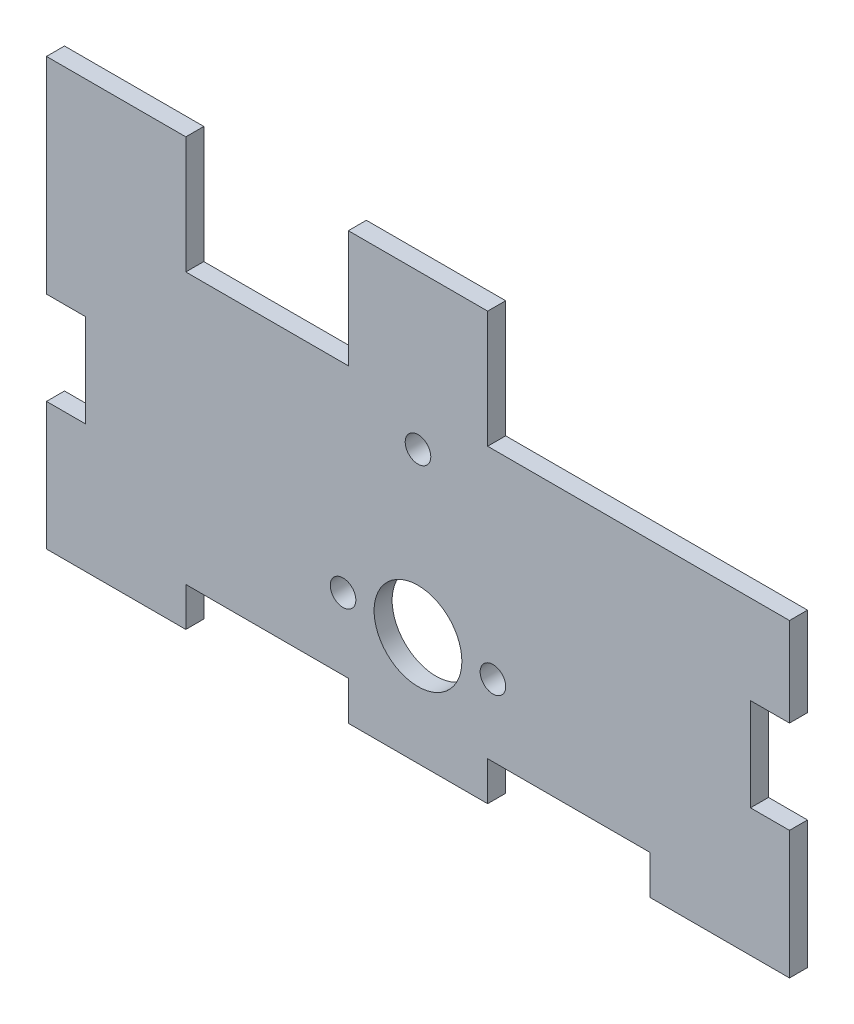
ISO-10303-21;
HEADER;
FILE_DESCRIPTION(('STEP AP214'),'2;1');
FILE_NAME('part.step','',(''),(''),'','','');
FILE_SCHEMA(('AUTOMOTIVE_DESIGN { 1 0 10303 214 1 1 1 1 }'));
ENDSEC;
DATA;
#1=APPLICATION_CONTEXT('core data for automotive mechanical design processes');
#2=APPLICATION_PROTOCOL_DEFINITION('international standard','automotive_design',2000,#1);
#3=PRODUCT_CONTEXT('',#1,'mechanical');
#4=PRODUCT('Part','Part','',(#3));
#5=PRODUCT_RELATED_PRODUCT_CATEGORY('part','',(#4));
#6=PRODUCT_DEFINITION_FORMATION('','',#4);
#7=PRODUCT_DEFINITION_CONTEXT('part definition',#1,'design');
#8=PRODUCT_DEFINITION('design','',#6,#7);
#9=PRODUCT_DEFINITION_SHAPE('','',#8);
#10=(LENGTH_UNIT() NAMED_UNIT(*) SI_UNIT(.MILLI.,.METRE.));
#11=(NAMED_UNIT(*) PLANE_ANGLE_UNIT() SI_UNIT($,.RADIAN.));
#12=(NAMED_UNIT(*) SI_UNIT($,.STERADIAN.) SOLID_ANGLE_UNIT());
#13=UNCERTAINTY_MEASURE_WITH_UNIT(LENGTH_MEASURE(1.E-05),#10,'distance_accuracy_value','');
#14=(GEOMETRIC_REPRESENTATION_CONTEXT(3) GLOBAL_UNCERTAINTY_ASSIGNED_CONTEXT((#13)) GLOBAL_UNIT_ASSIGNED_CONTEXT((#10,
#11,#12)) REPRESENTATION_CONTEXT('',''));
#15=CARTESIAN_POINT('',(0.,0.,0.));
#16=DIRECTION('',(0.,0.,1.));
#17=DIRECTION('',(1.,0.,0.));
#18=AXIS2_PLACEMENT_3D('',#15,#16,#17);
#19=CARTESIAN_POINT('',(-50.8,18.499999957,2.4638));
#20=DIRECTION('',(0.,-1.,0.));
#21=DIRECTION('',(0.,0.,-1.));
#22=AXIS2_PLACEMENT_3D('',#19,#20,#21);
#23=PLANE('',#22);
#24=DIRECTION('',(0.,0.,-1.));
#25=VECTOR('',#24,1.);
#26=CARTESIAN_POINT('',(9.525,18.499999957,-6.59758706000879E-12));
#27=LINE('',#26,#25);
#28=CARTESIAN_POINT('',(9.525,18.499999957,2.4638));
#29=VERTEX_POINT('',#28);
#30=CARTESIAN_POINT('',(9.525,18.499999957,0.));
#31=VERTEX_POINT('',#30);
#32=EDGE_CURVE('E58',#29,#31,#27,.T.);
#33=ORIENTED_EDGE('',*,*,#32,.F.);
#34=DIRECTION('',(-1.,0.,0.));
#35=VECTOR('',#34,1.);
#36=CARTESIAN_POINT('',(-50.8,18.499999957,2.4638));
#37=LINE('',#36,#35);
#38=CARTESIAN_POINT('',(50.8,18.499999957,2.4638));
#39=VERTEX_POINT('',#38);
#40=EDGE_CURVE('E259',#39,#29,#37,.T.);
#41=ORIENTED_EDGE('',*,*,#40,.F.);
#42=DIRECTION('',(0.,0.,-1.));
#43=VECTOR('',#42,1.);
#44=CARTESIAN_POINT('',(50.8,18.499999957,2.4638));
#45=LINE('',#44,#43);
#46=CARTESIAN_POINT('',(50.8,18.499999957,0.));
#47=VERTEX_POINT('',#46);
#48=EDGE_CURVE('E295',#39,#47,#45,.T.);
#49=ORIENTED_EDGE('',*,*,#48,.T.);
#50=DIRECTION('',(-1.,0.,0.));
#51=VECTOR('',#50,1.);
#52=CARTESIAN_POINT('',(-50.8,18.499999957,0.));
#53=LINE('',#52,#51);
#54=EDGE_CURVE('E271',#47,#31,#53,.T.);
#55=ORIENTED_EDGE('',*,*,#54,.T.);
#56=EDGE_LOOP('',(#33,#41,#49,#55));
#57=FACE_BOUND('',#56,.T.);
#58=ADVANCED_FACE('F33',(#57),#23,.F.);
#59=DIRECTION('',(0.,0.,1.));
#60=VECTOR('',#59,1.);
#61=CARTESIAN_POINT('',(-9.525,18.499999957,-6.59758706000879E-12));
#62=LINE('',#61,#60);
#63=CARTESIAN_POINT('',(-9.525,18.499999957,-6.59758706000879E-12));
#64=VERTEX_POINT('',#63);
#65=CARTESIAN_POINT('',(-9.525,18.499999957,2.4638));
#66=VERTEX_POINT('',#65);
#67=EDGE_CURVE('E231',#64,#66,#62,.T.);
#68=ORIENTED_EDGE('',*,*,#67,.F.);
#69=CARTESIAN_POINT('',(-31.75,18.499999957,0.));
#70=VERTEX_POINT('',#69);
#71=EDGE_CURVE('E269',#64,#70,#53,.T.);
#72=ORIENTED_EDGE('',*,*,#71,.T.);
#73=DIRECTION('',(0.,0.,-1.));
#74=VECTOR('',#73,1.);
#75=CARTESIAN_POINT('',(-31.75,18.499999957,0.));
#76=LINE('',#75,#74);
#77=CARTESIAN_POINT('',(-31.75,18.499999957,2.4638));
#78=VERTEX_POINT('',#77);
#79=EDGE_CURVE('E234',#78,#70,#76,.T.);
#80=ORIENTED_EDGE('',*,*,#79,.F.);
#81=EDGE_CURVE('E37',#66,#78,#37,.T.);
#82=ORIENTED_EDGE('',*,*,#81,.F.);
#83=EDGE_LOOP('',(#68,#72,#80,#82));
#84=FACE_BOUND('',#83,.T.);
#85=ADVANCED_FACE('F423',(#84),#23,.F.);
#86=CARTESIAN_POINT('',(50.8,18.499999957,2.4638));
#87=DIRECTION('',(-1.,0.,0.));
#88=DIRECTION('',(0.,-1.,0.));
#89=AXIS2_PLACEMENT_3D('',#86,#87,#88);
#90=PLANE('',#89);
#91=DIRECTION('',(0.,1.,0.));
#92=VECTOR('',#91,1.);
#93=CARTESIAN_POINT('',(50.8,18.499999957,0.));
#94=LINE('',#93,#92);
#95=CARTESIAN_POINT('',(50.8,-23.833999957,0.));
#96=VERTEX_POINT('',#95);
#97=CARTESIAN_POINT('',(50.8,-6.35,0.));
#98=VERTEX_POINT('',#97);
#99=EDGE_CURVE('E272',#96,#98,#94,.T.);
#100=ORIENTED_EDGE('',*,*,#99,.T.);
#101=DIRECTION('',(0.,0.,1.));
#102=VECTOR('',#101,1.);
#103=CARTESIAN_POINT('',(50.8,-6.35,2.4638));
#104=LINE('',#103,#102);
#105=CARTESIAN_POINT('',(50.8,-6.35,2.4638));
#106=VERTEX_POINT('',#105);
#107=EDGE_CURVE('E504',#98,#106,#104,.T.);
#108=ORIENTED_EDGE('',*,*,#107,.T.);
#109=DIRECTION('',(0.,1.,0.));
#110=VECTOR('',#109,1.);
#111=CARTESIAN_POINT('',(50.8,18.499999957,2.4638));
#112=LINE('',#111,#110);
#113=CARTESIAN_POINT('',(50.8,-23.833999957,2.4638));
#114=VERTEX_POINT('',#113);
#115=EDGE_CURVE('E351',#114,#106,#112,.T.);
#116=ORIENTED_EDGE('',*,*,#115,.F.);
#117=DIRECTION('',(0.,0.,1.));
#118=VECTOR('',#117,1.);
#119=CARTESIAN_POINT('',(50.8,-23.833999957,2.4638));
#120=LINE('',#119,#118);
#121=EDGE_CURVE('E451',#96,#114,#120,.T.);
#122=ORIENTED_EDGE('',*,*,#121,.F.);
#123=EDGE_LOOP('',(#100,#108,#116,#122));
#124=FACE_BOUND('',#123,.T.);
#125=ADVANCED_FACE('F502',(#124),#90,.F.);
#126=CARTESIAN_POINT('',(-50.8,18.499999957,2.4638));
#127=DIRECTION('',(1.,0.,0.));
#128=DIRECTION('',(0.,1.,0.));
#129=AXIS2_PLACEMENT_3D('',#126,#127,#128);
#130=PLANE('',#129);
#131=DIRECTION('',(0.,-1.,0.));
#132=VECTOR('',#131,1.);
#133=CARTESIAN_POINT('',(-50.8,18.499999957,2.4638));
#134=LINE('',#133,#132);
#135=CARTESIAN_POINT('',(-50.8,-6.35,2.4638));
#136=VERTEX_POINT('',#135);
#137=CARTESIAN_POINT('',(-50.8,-23.833999957,2.4638));
#138=VERTEX_POINT('',#137);
#139=EDGE_CURVE('E403',#136,#138,#134,.T.);
#140=ORIENTED_EDGE('',*,*,#139,.F.);
#141=DIRECTION('',(0.,0.,-1.));
#142=VECTOR('',#141,1.);
#143=CARTESIAN_POINT('',(-50.8,-6.35,2.4638));
#144=LINE('',#143,#142);
#145=CARTESIAN_POINT('',(-50.8,-6.35,0.));
#146=VERTEX_POINT('',#145);
#147=EDGE_CURVE('E379',#136,#146,#144,.T.);
#148=ORIENTED_EDGE('',*,*,#147,.T.);
#149=DIRECTION('',(0.,-1.,0.));
#150=VECTOR('',#149,1.);
#151=CARTESIAN_POINT('',(-50.8,18.499999957,0.));
#152=LINE('',#151,#150);
#153=CARTESIAN_POINT('',(-50.8,-23.833999957,0.));
#154=VERTEX_POINT('',#153);
#155=EDGE_CURVE('E280',#146,#154,#152,.T.);
#156=ORIENTED_EDGE('',*,*,#155,.T.);
#157=DIRECTION('',(0.,0.,-1.));
#158=VECTOR('',#157,1.);
#159=CARTESIAN_POINT('',(-50.8,-23.833999957,2.4638));
#160=LINE('',#159,#158);
#161=EDGE_CURVE('E316',#138,#154,#160,.T.);
#162=ORIENTED_EDGE('',*,*,#161,.F.);
#163=EDGE_LOOP('',(#140,#148,#156,#162));
#164=FACE_BOUND('',#163,.T.);
#165=ADVANCED_FACE('F377',(#164),#130,.F.);
#166=CARTESIAN_POINT('',(-50.8,-18.499999957,2.4638));
#167=DIRECTION('',(0.,1.,0.));
#168=DIRECTION('',(0.,0.,1.));
#169=AXIS2_PLACEMENT_3D('',#166,#167,#168);
#170=PLANE('',#169);
#171=DIRECTION('',(0.,0.,-1.));
#172=VECTOR('',#171,1.);
#173=CARTESIAN_POINT('',(31.75,-18.499999957,2.4638));
#174=LINE('',#173,#172);
#175=CARTESIAN_POINT('',(31.75,-18.499999957,2.4638));
#176=VERTEX_POINT('',#175);
#177=CARTESIAN_POINT('',(31.75,-18.499999957,0.));
#178=VERTEX_POINT('',#177);
#179=EDGE_CURVE('E437',#176,#178,#174,.T.);
#180=ORIENTED_EDGE('',*,*,#179,.F.);
#181=DIRECTION('',(1.,0.,0.));
#182=VECTOR('',#181,1.);
#183=CARTESIAN_POINT('',(-50.8,-18.499999957,2.4638));
#184=LINE('',#183,#182);
#185=CARTESIAN_POINT('',(9.52499999999999,-18.499999957,2.4638));
#186=VERTEX_POINT('',#185);
#187=EDGE_CURVE('E296',#186,#176,#184,.T.);
#188=ORIENTED_EDGE('',*,*,#187,.F.);
#189=DIRECTION('',(0.,0.,1.));
#190=VECTOR('',#189,1.);
#191=CARTESIAN_POINT('',(9.525,-18.499999957,2.4637999999934));
#192=LINE('',#191,#190);
#193=CARTESIAN_POINT('',(9.525,-18.499999957,0.));
#194=VERTEX_POINT('',#193);
#195=EDGE_CURVE('E461',#194,#186,#192,.T.);
#196=ORIENTED_EDGE('',*,*,#195,.F.);
#197=DIRECTION('',(1.,0.,0.));
#198=VECTOR('',#197,1.);
#199=CARTESIAN_POINT('',(-50.8,-18.499999957,0.));
#200=LINE('',#199,#198);
#201=EDGE_CURVE('E301',#194,#178,#200,.T.);
#202=ORIENTED_EDGE('',*,*,#201,.T.);
#203=EDGE_LOOP('',(#180,#188,#196,#202));
#204=FACE_BOUND('',#203,.T.);
#205=ADVANCED_FACE('F492',(#204),#170,.F.);
#206=DIRECTION('',(0.,0.,-1.));
#207=VECTOR('',#206,1.);
#208=CARTESIAN_POINT('',(-9.52500000000001,-18.499999957,2.4637999999934));
#209=LINE('',#208,#207);
#210=CARTESIAN_POINT('',(-9.52500000000001,-18.499999957,2.4638));
#211=VERTEX_POINT('',#210);
#212=CARTESIAN_POINT('',(-9.52500000000001,-18.499999957,0.));
#213=VERTEX_POINT('',#212);
#214=EDGE_CURVE('E466',#211,#213,#209,.T.);
#215=ORIENTED_EDGE('',*,*,#214,.F.);
#216=CARTESIAN_POINT('',(-31.75,-18.499999957,2.4638));
#217=VERTEX_POINT('',#216);
#218=EDGE_CURVE('E299',#217,#211,#184,.T.);
#219=ORIENTED_EDGE('',*,*,#218,.F.);
#220=DIRECTION('',(0.,0.,1.));
#221=VECTOR('',#220,1.);
#222=CARTESIAN_POINT('',(-31.75,-18.499999957,2.4638));
#223=LINE('',#222,#221);
#224=CARTESIAN_POINT('',(-31.75,-18.499999957,0.));
#225=VERTEX_POINT('',#224);
#226=EDGE_CURVE('E312',#225,#217,#223,.T.);
#227=ORIENTED_EDGE('',*,*,#226,.F.);
#228=EDGE_CURVE('E310',#225,#213,#200,.T.);
#229=ORIENTED_EDGE('',*,*,#228,.T.);
#230=EDGE_LOOP('',(#215,#219,#227,#229));
#231=FACE_BOUND('',#230,.T.);
#232=ADVANCED_FACE('F543',(#231),#170,.F.);
#233=CARTESIAN_POINT('',(50.8,6.35,2.4638));
#234=VERTEX_POINT('',#233);
#235=EDGE_CURVE('E353',#234,#39,#112,.T.);
#236=ORIENTED_EDGE('',*,*,#235,.F.);
#237=DIRECTION('',(0.,0.,-1.));
#238=VECTOR('',#237,1.);
#239=CARTESIAN_POINT('',(50.8,6.35,2.4638));
#240=LINE('',#239,#238);
#241=CARTESIAN_POINT('',(50.8,6.35,0.));
#242=VERTEX_POINT('',#241);
#243=EDGE_CURVE('E507',#234,#242,#240,.T.);
#244=ORIENTED_EDGE('',*,*,#243,.T.);
#245=EDGE_CURVE('E348',#242,#47,#94,.T.);
#246=ORIENTED_EDGE('',*,*,#245,.T.);
#247=ORIENTED_EDGE('',*,*,#48,.F.);
#248=EDGE_LOOP('',(#236,#244,#246,#247));
#249=FACE_BOUND('',#248,.T.);
#250=ADVANCED_FACE('F35',(#249),#90,.F.);
#251=CARTESIAN_POINT('',(-50.8,34.501999957,0.));
#252=VERTEX_POINT('',#251);
#253=CARTESIAN_POINT('',(-50.8,6.35,0.));
#254=VERTEX_POINT('',#253);
#255=EDGE_CURVE('E277',#252,#254,#152,.T.);
#256=ORIENTED_EDGE('',*,*,#255,.T.);
#257=DIRECTION('',(0.,0.,1.));
#258=VECTOR('',#257,1.);
#259=CARTESIAN_POINT('',(-50.8,6.35,2.4638));
#260=LINE('',#259,#258);
#261=CARTESIAN_POINT('',(-50.8,6.35,2.4638));
#262=VERTEX_POINT('',#261);
#263=EDGE_CURVE('E433',#254,#262,#260,.T.);
#264=ORIENTED_EDGE('',*,*,#263,.T.);
#265=CARTESIAN_POINT('',(-50.8,34.501999957,2.4638));
#266=VERTEX_POINT('',#265);
#267=EDGE_CURVE('E300',#266,#262,#134,.T.);
#268=ORIENTED_EDGE('',*,*,#267,.F.);
#269=DIRECTION('',(0.,0.,1.));
#270=VECTOR('',#269,1.);
#271=CARTESIAN_POINT('',(-50.8,34.501999957,0.));
#272=LINE('',#271,#270);
#273=EDGE_CURVE('E237',#252,#266,#272,.T.);
#274=ORIENTED_EDGE('',*,*,#273,.F.);
#275=EDGE_LOOP('',(#256,#264,#268,#274));
#276=FACE_BOUND('',#275,.T.);
#277=ADVANCED_FACE('F432',(#276),#130,.F.);
#278=CARTESIAN_POINT('',(0.,0.,2.4638));
#279=DIRECTION('',(0.,0.,1.));
#280=DIRECTION('',(1.,0.,0.));
#281=AXIS2_PLACEMENT_3D('',#278,#279,#280);
#282=PLANE('',#281);
#283=DIRECTION('',(1.,0.,0.));
#284=VECTOR('',#283,1.);
#285=CARTESIAN_POINT('',(56.134,-6.35,2.4638));
#286=LINE('',#285,#284);
#287=CARTESIAN_POINT('',(45.466,-6.35,2.4638));
#288=VERTEX_POINT('',#287);
#289=EDGE_CURVE('E788',#288,#106,#286,.T.);
#290=ORIENTED_EDGE('',*,*,#289,.F.);
#291=DIRECTION('',(0.,-1.,0.));
#292=VECTOR('',#291,1.);
#293=CARTESIAN_POINT('',(45.466,6.35,2.4638));
#294=LINE('',#293,#292);
#295=CARTESIAN_POINT('',(45.466,6.35,2.4638));
#296=VERTEX_POINT('',#295);
#297=EDGE_CURVE('E790',#296,#288,#294,.T.);
#298=ORIENTED_EDGE('',*,*,#297,.F.);
#299=DIRECTION('',(-1.,0.,0.));
#300=VECTOR('',#299,1.);
#301=CARTESIAN_POINT('',(56.134,6.35,2.4638));
#302=LINE('',#301,#300);
#303=EDGE_CURVE('E255',#234,#296,#302,.T.);
#304=ORIENTED_EDGE('',*,*,#303,.F.);
#305=ORIENTED_EDGE('',*,*,#235,.T.);
#306=ORIENTED_EDGE('',*,*,#40,.T.);
#307=DIRECTION('',(0.,-1.,0.));
#308=VECTOR('',#307,1.);
#309=CARTESIAN_POINT('',(9.525,34.501999957,2.4638));
#310=LINE('',#309,#308);
#311=CARTESIAN_POINT('',(9.525,34.501999957,2.4638));
#312=VERTEX_POINT('',#311);
#313=EDGE_CURVE('E408',#312,#29,#310,.T.);
#314=ORIENTED_EDGE('',*,*,#313,.F.);
#315=DIRECTION('',(1.,0.,0.));
#316=VECTOR('',#315,1.);
#317=CARTESIAN_POINT('',(-9.525,34.501999957,2.4638));
#318=LINE('',#317,#316);
#319=CARTESIAN_POINT('',(-9.525,34.501999957,2.4638));
#320=VERTEX_POINT('',#319);
#321=EDGE_CURVE('E227',#320,#312,#318,.T.);
#322=ORIENTED_EDGE('',*,*,#321,.F.);
#323=DIRECTION('',(0.,-1.,0.));
#324=VECTOR('',#323,1.);
#325=CARTESIAN_POINT('',(-9.525,34.501999957,2.4638));
#326=LINE('',#325,#324);
#327=EDGE_CURVE('E239',#320,#66,#326,.T.);
#328=ORIENTED_EDGE('',*,*,#327,.T.);
#329=ORIENTED_EDGE('',*,*,#81,.T.);
#330=DIRECTION('',(0.,-1.,0.));
#331=VECTOR('',#330,1.);
#332=CARTESIAN_POINT('',(-31.75,34.501999957,2.4638));
#333=LINE('',#332,#331);
#334=CARTESIAN_POINT('',(-31.75,34.501999957,2.4638));
#335=VERTEX_POINT('',#334);
#336=EDGE_CURVE('E263',#335,#78,#333,.T.);
#337=ORIENTED_EDGE('',*,*,#336,.F.);
#338=DIRECTION('',(1.,0.,0.));
#339=VECTOR('',#338,1.);
#340=CARTESIAN_POINT('',(-50.8,34.501999957,2.4638));
#341=LINE('',#340,#339);
#342=EDGE_CURVE('E245',#266,#335,#341,.T.);
#343=ORIENTED_EDGE('',*,*,#342,.F.);
#344=ORIENTED_EDGE('',*,*,#267,.T.);
#345=DIRECTION('',(-1.,0.,0.));
#346=VECTOR('',#345,1.);
#347=CARTESIAN_POINT('',(-56.134,6.35,2.4638));
#348=LINE('',#347,#346);
#349=CARTESIAN_POINT('',(-45.466,6.35,2.4638));
#350=VERTEX_POINT('',#349);
#351=EDGE_CURVE('E431',#350,#262,#348,.T.);
#352=ORIENTED_EDGE('',*,*,#351,.F.);
#353=DIRECTION('',(0.,1.,0.));
#354=VECTOR('',#353,1.);
#355=CARTESIAN_POINT('',(-45.466,6.35,2.4638));
#356=LINE('',#355,#354);
#357=CARTESIAN_POINT('',(-45.466,-6.35,2.4638));
#358=VERTEX_POINT('',#357);
#359=EDGE_CURVE('E506',#358,#350,#356,.T.);
#360=ORIENTED_EDGE('',*,*,#359,.F.);
#361=DIRECTION('',(1.,0.,0.));
#362=VECTOR('',#361,1.);
#363=CARTESIAN_POINT('',(-56.134,-6.35,2.4638));
#364=LINE('',#363,#362);
#365=EDGE_CURVE('E406',#136,#358,#364,.T.);
#366=ORIENTED_EDGE('',*,*,#365,.F.);
#367=ORIENTED_EDGE('',*,*,#139,.T.);
#368=DIRECTION('',(-1.,0.,0.));
#369=VECTOR('',#368,1.);
#370=CARTESIAN_POINT('',(-50.8,-23.833999957,2.4638));
#371=LINE('',#370,#369);
#372=CARTESIAN_POINT('',(-31.75,-23.833999957,2.4638));
#373=VERTEX_POINT('',#372);
#374=EDGE_CURVE('E323',#373,#138,#371,.T.);
#375=ORIENTED_EDGE('',*,*,#374,.F.);
#376=DIRECTION('',(0.,1.,0.));
#377=VECTOR('',#376,1.);
#378=CARTESIAN_POINT('',(-31.75,-23.833999957,2.4638));
#379=LINE('',#378,#377);
#380=EDGE_CURVE('E318',#373,#217,#379,.T.);
#381=ORIENTED_EDGE('',*,*,#380,.T.);
#382=ORIENTED_EDGE('',*,*,#218,.T.);
#383=DIRECTION('',(0.,1.,0.));
#384=VECTOR('',#383,1.);
#385=CARTESIAN_POINT('',(-9.52500000000001,-23.833999957,2.4637999999934));
#386=LINE('',#385,#384);
#387=CARTESIAN_POINT('',(-9.52500000000001,-23.833999957,2.4637999999934));
#388=VERTEX_POINT('',#387);
#389=EDGE_CURVE('E480',#388,#211,#386,.T.);
#390=ORIENTED_EDGE('',*,*,#389,.F.);
#391=DIRECTION('',(-1.,0.,0.));
#392=VECTOR('',#391,1.);
#393=CARTESIAN_POINT('',(-9.52500000000001,-23.833999957,2.4637999999934));
#394=LINE('',#393,#392);
#395=CARTESIAN_POINT('',(9.525,-23.833999957,2.4637999999934));
#396=VERTEX_POINT('',#395);
#397=EDGE_CURVE('E465',#396,#388,#394,.T.);
#398=ORIENTED_EDGE('',*,*,#397,.F.);
#399=DIRECTION('',(0.,1.,0.));
#400=VECTOR('',#399,1.);
#401=CARTESIAN_POINT('',(9.525,-23.833999957,2.4637999999934));
#402=LINE('',#401,#400);
#403=EDGE_CURVE('E317',#396,#186,#402,.T.);
#404=ORIENTED_EDGE('',*,*,#403,.T.);
#405=ORIENTED_EDGE('',*,*,#187,.T.);
#406=DIRECTION('',(0.,1.,0.));
#407=VECTOR('',#406,1.);
#408=CARTESIAN_POINT('',(31.75,-23.833999957,2.4638));
#409=LINE('',#408,#407);
#410=CARTESIAN_POINT('',(31.75,-23.833999957,2.4638));
#411=VERTEX_POINT('',#410);
#412=EDGE_CURVE('E458',#411,#176,#409,.T.);
#413=ORIENTED_EDGE('',*,*,#412,.F.);
#414=DIRECTION('',(-1.,0.,0.));
#415=VECTOR('',#414,1.);
#416=CARTESIAN_POINT('',(50.8,-23.833999957,2.4638));
#417=LINE('',#416,#415);
#418=EDGE_CURVE('E443',#114,#411,#417,.T.);
#419=ORIENTED_EDGE('',*,*,#418,.F.);
#420=ORIENTED_EDGE('',*,*,#115,.T.);
#421=EDGE_LOOP('',(#290,#298,#304,#305,#306,#314,#322,#328,#329,#337,#343,#344,#352,#360,#366,
#367,#375,#381,#382,#390,#398,#404,#405,#413,#419,#420));
#422=FACE_BOUND('',#421,.T.);
#423=CARTESIAN_POINT('',(10.250000074,-8.730000066,2.4638));
#424=DIRECTION('',(0.,0.,1.));
#425=DIRECTION('',(-1.,0.,0.));
#426=AXIS2_PLACEMENT_3D('',#423,#424,#425);
#427=CIRCLE('',#426,1.750000056);
#428=CARTESIAN_POINT('',(8.500000018,-8.730000066,2.4638));
#429=VERTEX_POINT('',#428);
#430=EDGE_CURVE('E329',#429,#429,#427,.T.);
#431=ORIENTED_EDGE('',*,*,#430,.F.);
#432=EDGE_LOOP('',(#431));
#433=FACE_BOUND('',#432,.T.);
#434=CARTESIAN_POINT('',(0.,13.36999993,2.4638));
#435=DIRECTION('',(0.,0.,1.));
#436=DIRECTION('',(1.,0.,0.));
#437=AXIS2_PLACEMENT_3D('',#434,#435,#436);
#438=CIRCLE('',#437,1.750000056);
#439=CARTESIAN_POINT('',(1.750000056,13.36999993,2.4638));
#440=VERTEX_POINT('',#439);
#441=EDGE_CURVE('E328',#440,#440,#438,.T.);
#442=ORIENTED_EDGE('',*,*,#441,.F.);
#443=EDGE_LOOP('',(#442));
#444=FACE_BOUND('',#443,.T.);
#445=CARTESIAN_POINT('',(-10.250000074,-8.730000066,2.4638));
#446=DIRECTION('',(0.,0.,1.));
#447=DIRECTION('',(1.,0.,0.));
#448=AXIS2_PLACEMENT_3D('',#445,#446,#447);
#449=CIRCLE('',#448,1.750000056);
#450=CARTESIAN_POINT('',(-8.500000018,-8.730000066,2.4638));
#451=VERTEX_POINT('',#450);
#452=EDGE_CURVE('E336',#451,#451,#449,.T.);
#453=ORIENTED_EDGE('',*,*,#452,.F.);
#454=EDGE_LOOP('',(#453));
#455=FACE_BOUND('',#454,.T.);
#456=CARTESIAN_POINT('',(0.,-8.730000066,2.4638));
#457=DIRECTION('',(0.,0.,1.));
#458=DIRECTION('',(1.,0.,0.));
#459=AXIS2_PLACEMENT_3D('',#456,#457,#458);
#460=CIRCLE('',#459,5.999999938);
#461=CARTESIAN_POINT('',(5.999999938,-8.730000066,2.4638));
#462=VERTEX_POINT('',#461);
#463=EDGE_CURVE('E342',#462,#462,#460,.T.);
#464=ORIENTED_EDGE('',*,*,#463,.F.);
#465=EDGE_LOOP('',(#464));
#466=FACE_BOUND('',#465,.T.);
#467=ADVANCED_FACE('F400',(#422,#433,#444,#455,#466),#282,.T.);
#468=CARTESIAN_POINT('',(0.,0.,0.));
#469=DIRECTION('',(0.,0.,1.));
#470=DIRECTION('',(1.,0.,0.));
#471=AXIS2_PLACEMENT_3D('',#468,#469,#470);
#472=PLANE('',#471);
#473=CARTESIAN_POINT('',(10.250000074,-8.730000066,0.));
#474=DIRECTION('',(0.,0.,1.));
#475=DIRECTION('',(-1.,0.,0.));
#476=AXIS2_PLACEMENT_3D('',#473,#474,#475);
#477=CIRCLE('',#476,1.750000056);
#478=CARTESIAN_POINT('',(8.500000018,-8.730000066,0.));
#479=VERTEX_POINT('',#478);
#480=EDGE_CURVE('E325',#479,#479,#477,.T.);
#481=ORIENTED_EDGE('',*,*,#480,.T.);
#482=EDGE_LOOP('',(#481));
#483=FACE_BOUND('',#482,.T.);
#484=CARTESIAN_POINT('',(0.,13.36999993,0.));
#485=DIRECTION('',(0.,0.,1.));
#486=DIRECTION('',(1.,0.,0.));
#487=AXIS2_PLACEMENT_3D('',#484,#485,#486);
#488=CIRCLE('',#487,1.750000056);
#489=CARTESIAN_POINT('',(1.750000056,13.36999993,0.));
#490=VERTEX_POINT('',#489);
#491=EDGE_CURVE('E333',#490,#490,#488,.T.);
#492=ORIENTED_EDGE('',*,*,#491,.T.);
#493=EDGE_LOOP('',(#492));
#494=FACE_BOUND('',#493,.T.);
#495=CARTESIAN_POINT('',(-10.250000074,-8.730000066,0.));
#496=DIRECTION('',(0.,0.,1.));
#497=DIRECTION('',(1.,0.,0.));
#498=AXIS2_PLACEMENT_3D('',#495,#496,#497);
#499=CIRCLE('',#498,1.750000056);
#500=CARTESIAN_POINT('',(-8.500000018,-8.730000066,0.));
#501=VERTEX_POINT('',#500);
#502=EDGE_CURVE('E339',#501,#501,#499,.T.);
#503=ORIENTED_EDGE('',*,*,#502,.T.);
#504=EDGE_LOOP('',(#503));
#505=FACE_BOUND('',#504,.T.);
#506=CARTESIAN_POINT('',(0.,-8.730000066,0.));
#507=DIRECTION('',(0.,0.,1.));
#508=DIRECTION('',(1.,0.,0.));
#509=AXIS2_PLACEMENT_3D('',#506,#507,#508);
#510=CIRCLE('',#509,5.999999938);
#511=CARTESIAN_POINT('',(5.999999938,-8.730000066,0.));
#512=VERTEX_POINT('',#511);
#513=EDGE_CURVE('E345',#512,#512,#510,.T.);
#514=ORIENTED_EDGE('',*,*,#513,.T.);
#515=EDGE_LOOP('',(#514));
#516=FACE_BOUND('',#515,.T.);
#517=DIRECTION('',(0.,-1.,0.));
#518=VECTOR('',#517,1.);
#519=CARTESIAN_POINT('',(45.466,0.,0.));
#520=LINE('',#519,#518);
#521=CARTESIAN_POINT('',(45.466,6.35,0.));
#522=VERTEX_POINT('',#521);
#523=CARTESIAN_POINT('',(45.466,-6.35,0.));
#524=VERTEX_POINT('',#523);
#525=EDGE_CURVE('E43',#522,#524,#520,.T.);
#526=ORIENTED_EDGE('',*,*,#525,.T.);
#527=DIRECTION('',(1.,0.,0.));
#528=VECTOR('',#527,1.);
#529=CARTESIAN_POINT('',(0.,-6.35,0.));
#530=LINE('',#529,#528);
#531=EDGE_CURVE('E11',#524,#98,#530,.T.);
#532=ORIENTED_EDGE('',*,*,#531,.T.);
#533=ORIENTED_EDGE('',*,*,#99,.F.);
#534=DIRECTION('',(1.,0.,0.));
#535=VECTOR('',#534,1.);
#536=CARTESIAN_POINT('',(50.8,-23.833999957,0.));
#537=LINE('',#536,#535);
#538=CARTESIAN_POINT('',(31.75,-23.833999957,0.));
#539=VERTEX_POINT('',#538);
#540=EDGE_CURVE('E448',#539,#96,#537,.T.);
#541=ORIENTED_EDGE('',*,*,#540,.F.);
#542=DIRECTION('',(0.,1.,0.));
#543=VECTOR('',#542,1.);
#544=CARTESIAN_POINT('',(31.75,-23.833999957,0.));
#545=LINE('',#544,#543);
#546=EDGE_CURVE('E454',#539,#178,#545,.T.);
#547=ORIENTED_EDGE('',*,*,#546,.T.);
#548=ORIENTED_EDGE('',*,*,#201,.F.);
#549=DIRECTION('',(0.,1.,0.));
#550=VECTOR('',#549,1.);
#551=CARTESIAN_POINT('',(9.525,-23.833999957,0.));
#552=LINE('',#551,#550);
#553=CARTESIAN_POINT('',(9.525,-23.833999957,0.));
#554=VERTEX_POINT('',#553);
#555=EDGE_CURVE('E472',#554,#194,#552,.T.);
#556=ORIENTED_EDGE('',*,*,#555,.F.);
#557=DIRECTION('',(1.,0.,0.));
#558=VECTOR('',#557,1.);
#559=CARTESIAN_POINT('',(-9.52500000000001,-23.833999957,0.));
#560=LINE('',#559,#558);
#561=CARTESIAN_POINT('',(-9.52500000000001,-23.833999957,0.));
#562=VERTEX_POINT('',#561);
#563=EDGE_CURVE('E470',#562,#554,#560,.T.);
#564=ORIENTED_EDGE('',*,*,#563,.F.);
#565=DIRECTION('',(0.,1.,0.));
#566=VECTOR('',#565,1.);
#567=CARTESIAN_POINT('',(-9.52500000000001,-23.833999957,0.));
#568=LINE('',#567,#566);
#569=EDGE_CURVE('E478',#562,#213,#568,.T.);
#570=ORIENTED_EDGE('',*,*,#569,.T.);
#571=ORIENTED_EDGE('',*,*,#228,.F.);
#572=DIRECTION('',(0.,1.,0.));
#573=VECTOR('',#572,1.);
#574=CARTESIAN_POINT('',(-31.75,-23.833999957,0.));
#575=LINE('',#574,#573);
#576=CARTESIAN_POINT('',(-31.75,-23.833999957,0.));
#577=VERTEX_POINT('',#576);
#578=EDGE_CURVE('E332',#577,#225,#575,.T.);
#579=ORIENTED_EDGE('',*,*,#578,.F.);
#580=DIRECTION('',(1.,0.,0.));
#581=VECTOR('',#580,1.);
#582=CARTESIAN_POINT('',(-50.8,-23.833999957,0.));
#583=LINE('',#582,#581);
#584=EDGE_CURVE('E381',#154,#577,#583,.T.);
#585=ORIENTED_EDGE('',*,*,#584,.F.);
#586=ORIENTED_EDGE('',*,*,#155,.F.);
#587=DIRECTION('',(1.,0.,0.));
#588=VECTOR('',#587,1.);
#589=CARTESIAN_POINT('',(0.,-6.35,0.));
#590=LINE('',#589,#588);
#591=CARTESIAN_POINT('',(-45.466,-6.35,0.));
#592=VERTEX_POINT('',#591);
#593=EDGE_CURVE('E286',#146,#592,#590,.T.);
#594=ORIENTED_EDGE('',*,*,#593,.T.);
#595=DIRECTION('',(0.,1.,0.));
#596=VECTOR('',#595,1.);
#597=CARTESIAN_POINT('',(-45.466,0.,0.));
#598=LINE('',#597,#596);
#599=CARTESIAN_POINT('',(-45.466,6.35,0.));
#600=VERTEX_POINT('',#599);
#601=EDGE_CURVE('E289',#592,#600,#598,.T.);
#602=ORIENTED_EDGE('',*,*,#601,.T.);
#603=DIRECTION('',(-1.,0.,0.));
#604=VECTOR('',#603,1.);
#605=CARTESIAN_POINT('',(0.,6.35,0.));
#606=LINE('',#605,#604);
#607=EDGE_CURVE('E292',#600,#254,#606,.T.);
#608=ORIENTED_EDGE('',*,*,#607,.T.);
#609=ORIENTED_EDGE('',*,*,#255,.F.);
#610=DIRECTION('',(-1.,0.,0.));
#611=VECTOR('',#610,1.);
#612=CARTESIAN_POINT('',(-50.8,34.501999957,0.));
#613=LINE('',#612,#611);
#614=CARTESIAN_POINT('',(-31.75,34.501999957,0.));
#615=VERTEX_POINT('',#614);
#616=EDGE_CURVE('E249',#615,#252,#613,.T.);
#617=ORIENTED_EDGE('',*,*,#616,.F.);
#618=DIRECTION('',(0.,-1.,0.));
#619=VECTOR('',#618,1.);
#620=CARTESIAN_POINT('',(-31.75,34.501999957,0.));
#621=LINE('',#620,#619);
#622=EDGE_CURVE('E252',#615,#70,#621,.T.);
#623=ORIENTED_EDGE('',*,*,#622,.T.);
#624=ORIENTED_EDGE('',*,*,#71,.F.);
#625=DIRECTION('',(0.,-1.,0.));
#626=VECTOR('',#625,1.);
#627=CARTESIAN_POINT('',(-9.525,34.501999957,-6.59758706000879E-12));
#628=LINE('',#627,#626);
#629=CARTESIAN_POINT('',(-9.525,34.501999957,-6.59758706000879E-12));
#630=VERTEX_POINT('',#629);
#631=EDGE_CURVE('E218',#630,#64,#628,.T.);
#632=ORIENTED_EDGE('',*,*,#631,.F.);
#633=DIRECTION('',(-1.,0.,0.));
#634=VECTOR('',#633,1.);
#635=CARTESIAN_POINT('',(-9.525,34.501999957,-6.59758706000879E-12));
#636=LINE('',#635,#634);
#637=CARTESIAN_POINT('',(9.525,34.501999957,-6.59758706000879E-12));
#638=VERTEX_POINT('',#637);
#639=EDGE_CURVE('E210',#638,#630,#636,.T.);
#640=ORIENTED_EDGE('',*,*,#639,.F.);
#641=DIRECTION('',(0.,-1.,0.));
#642=VECTOR('',#641,1.);
#643=CARTESIAN_POINT('',(9.525,34.501999957,-6.59758706000879E-12));
#644=LINE('',#643,#642);
#645=EDGE_CURVE('E216',#638,#31,#644,.T.);
#646=ORIENTED_EDGE('',*,*,#645,.T.);
#647=ORIENTED_EDGE('',*,*,#54,.F.);
#648=ORIENTED_EDGE('',*,*,#245,.F.);
#649=DIRECTION('',(-1.,0.,0.));
#650=VECTOR('',#649,1.);
#651=CARTESIAN_POINT('',(0.,6.35,0.));
#652=LINE('',#651,#650);
#653=EDGE_CURVE('E283',#242,#522,#652,.T.);
#654=ORIENTED_EDGE('',*,*,#653,.T.);
#655=EDGE_LOOP('',(#526,#532,#533,#541,#547,#548,#556,#564,#570,#571,#579,#585,#586,#594,#602,
#608,#609,#617,#623,#624,#632,#640,#646,#647,#648,#654));
#656=FACE_BOUND('',#655,.T.);
#657=ADVANCED_FACE('F213',(#483,#494,#505,#516,#656),#472,.F.);
#658=CARTESIAN_POINT('',(0.,-8.730000066,0.));
#659=DIRECTION('',(0.,0.,1.));
#660=DIRECTION('',(1.,0.,0.));
#661=AXIS2_PLACEMENT_3D('',#658,#659,#660);
#662=CYLINDRICAL_SURFACE('',#661,5.999999938);
#663=ORIENTED_EDGE('',*,*,#513,.F.);
#664=EDGE_LOOP('',(#663));
#665=FACE_BOUND('',#664,.T.);
#666=ORIENTED_EDGE('',*,*,#463,.T.);
#667=EDGE_LOOP('',(#666));
#668=FACE_BOUND('',#667,.T.);
#669=ADVANCED_FACE('F546',(#665,#668),#662,.F.);
#670=CARTESIAN_POINT('',(-10.250000074,-8.730000066,0.));
#671=DIRECTION('',(0.,0.,1.));
#672=DIRECTION('',(1.,0.,0.));
#673=AXIS2_PLACEMENT_3D('',#670,#671,#672);
#674=CYLINDRICAL_SURFACE('',#673,1.750000056);
#675=ORIENTED_EDGE('',*,*,#502,.F.);
#676=EDGE_LOOP('',(#675));
#677=FACE_BOUND('',#676,.T.);
#678=ORIENTED_EDGE('',*,*,#452,.T.);
#679=EDGE_LOOP('',(#678));
#680=FACE_BOUND('',#679,.T.);
#681=ADVANCED_FACE('F552',(#677,#680),#674,.F.);
#682=CARTESIAN_POINT('',(0.,13.36999993,0.));
#683=DIRECTION('',(0.,0.,1.));
#684=DIRECTION('',(1.,0.,0.));
#685=AXIS2_PLACEMENT_3D('',#682,#683,#684);
#686=CYLINDRICAL_SURFACE('',#685,1.750000056);
#687=ORIENTED_EDGE('',*,*,#491,.F.);
#688=EDGE_LOOP('',(#687));
#689=FACE_BOUND('',#688,.T.);
#690=ORIENTED_EDGE('',*,*,#441,.T.);
#691=EDGE_LOOP('',(#690));
#692=FACE_BOUND('',#691,.T.);
#693=ADVANCED_FACE('F556',(#689,#692),#686,.F.);
#694=CARTESIAN_POINT('',(10.250000074,-8.730000066,0.));
#695=DIRECTION('',(0.,0.,1.));
#696=DIRECTION('',(1.,0.,0.));
#697=AXIS2_PLACEMENT_3D('',#694,#695,#696);
#698=CYLINDRICAL_SURFACE('',#697,1.750000056);
#699=ORIENTED_EDGE('',*,*,#480,.F.);
#700=EDGE_LOOP('',(#699));
#701=FACE_BOUND('',#700,.T.);
#702=ORIENTED_EDGE('',*,*,#430,.T.);
#703=EDGE_LOOP('',(#702));
#704=FACE_BOUND('',#703,.T.);
#705=ADVANCED_FACE('F560',(#701,#704),#698,.F.);
#706=CARTESIAN_POINT('',(-31.75,-23.833999957,2.4638));
#707=DIRECTION('',(-1.,0.,0.));
#708=DIRECTION('',(0.,0.,1.));
#709=AXIS2_PLACEMENT_3D('',#706,#707,#708);
#710=PLANE('',#709);
#711=ORIENTED_EDGE('',*,*,#226,.T.);
#712=ORIENTED_EDGE('',*,*,#380,.F.);
#713=DIRECTION('',(0.,0.,1.));
#714=VECTOR('',#713,1.);
#715=CARTESIAN_POINT('',(-31.75,-23.833999957,2.4638));
#716=LINE('',#715,#714);
#717=EDGE_CURVE('E385',#577,#373,#716,.T.);
#718=ORIENTED_EDGE('',*,*,#717,.F.);
#719=ORIENTED_EDGE('',*,*,#578,.T.);
#720=EDGE_LOOP('',(#711,#712,#718,#719));
#721=FACE_BOUND('',#720,.T.);
#722=ADVANCED_FACE('F399',(#721),#710,.F.);
#723=CARTESIAN_POINT('',(0.,-23.833999957,0.));
#724=DIRECTION('',(0.,-1.,0.));
#725=DIRECTION('',(0.,0.,-1.));
#726=AXIS2_PLACEMENT_3D('',#723,#724,#725);
#727=PLANE('',#726);
#728=ORIENTED_EDGE('',*,*,#161,.T.);
#729=ORIENTED_EDGE('',*,*,#584,.T.);
#730=ORIENTED_EDGE('',*,*,#717,.T.);
#731=ORIENTED_EDGE('',*,*,#374,.T.);
#732=EDGE_LOOP('',(#728,#729,#730,#731));
#733=FACE_BOUND('',#732,.T.);
#734=ADVANCED_FACE('F388',(#733),#727,.T.);
#735=CARTESIAN_POINT('',(9.525,-23.833999957,2.4637999999934));
#736=DIRECTION('',(-1.,0.,0.));
#737=DIRECTION('',(0.,0.,1.));
#738=AXIS2_PLACEMENT_3D('',#735,#736,#737);
#739=PLANE('',#738);
#740=ORIENTED_EDGE('',*,*,#195,.T.);
#741=ORIENTED_EDGE('',*,*,#403,.F.);
#742=DIRECTION('',(0.,0.,1.));
#743=VECTOR('',#742,1.);
#744=CARTESIAN_POINT('',(9.525,-23.833999957,2.4637999999934));
#745=LINE('',#744,#743);
#746=EDGE_CURVE('E462',#554,#396,#745,.T.);
#747=ORIENTED_EDGE('',*,*,#746,.F.);
#748=ORIENTED_EDGE('',*,*,#555,.T.);
#749=EDGE_LOOP('',(#740,#741,#747,#748));
#750=FACE_BOUND('',#749,.T.);
#751=ADVANCED_FACE('F490',(#750),#739,.F.);
#752=CARTESIAN_POINT('',(-9.52500000000001,-23.833999957,2.4637999999934));
#753=DIRECTION('',(1.,0.,0.));
#754=DIRECTION('',(0.,0.,-1.));
#755=AXIS2_PLACEMENT_3D('',#752,#753,#754);
#756=PLANE('',#755);
#757=ORIENTED_EDGE('',*,*,#214,.T.);
#758=ORIENTED_EDGE('',*,*,#569,.F.);
#759=DIRECTION('',(0.,0.,-1.));
#760=VECTOR('',#759,1.);
#761=CARTESIAN_POINT('',(-9.52500000000001,-23.833999957,2.4637999999934));
#762=LINE('',#761,#760);
#763=EDGE_CURVE('E468',#388,#562,#762,.T.);
#764=ORIENTED_EDGE('',*,*,#763,.F.);
#765=ORIENTED_EDGE('',*,*,#389,.T.);
#766=EDGE_LOOP('',(#757,#758,#764,#765));
#767=FACE_BOUND('',#766,.T.);
#768=ADVANCED_FACE('F571',(#767),#756,.F.);
#769=CARTESIAN_POINT('',(0.,-23.833999957,0.));
#770=DIRECTION('',(0.,-1.,0.));
#771=DIRECTION('',(0.,0.,-1.));
#772=AXIS2_PLACEMENT_3D('',#769,#770,#771);
#773=PLANE('',#772);
#774=ORIENTED_EDGE('',*,*,#746,.T.);
#775=ORIENTED_EDGE('',*,*,#397,.T.);
#776=ORIENTED_EDGE('',*,*,#763,.T.);
#777=ORIENTED_EDGE('',*,*,#563,.T.);
#778=EDGE_LOOP('',(#774,#775,#776,#777));
#779=FACE_BOUND('',#778,.T.);
#780=ADVANCED_FACE('F574',(#779),#773,.T.);
#781=CARTESIAN_POINT('',(31.75,-23.833999957,2.4638));
#782=DIRECTION('',(1.,0.,0.));
#783=DIRECTION('',(0.,0.,-1.));
#784=AXIS2_PLACEMENT_3D('',#781,#782,#783);
#785=PLANE('',#784);
#786=ORIENTED_EDGE('',*,*,#179,.T.);
#787=ORIENTED_EDGE('',*,*,#546,.F.);
#788=DIRECTION('',(0.,0.,-1.));
#789=VECTOR('',#788,1.);
#790=CARTESIAN_POINT('',(31.75,-23.833999957,2.4638));
#791=LINE('',#790,#789);
#792=EDGE_CURVE('E446',#411,#539,#791,.T.);
#793=ORIENTED_EDGE('',*,*,#792,.F.);
#794=ORIENTED_EDGE('',*,*,#412,.T.);
#795=EDGE_LOOP('',(#786,#787,#793,#794));
#796=FACE_BOUND('',#795,.T.);
#797=ADVANCED_FACE('F495',(#796),#785,.F.);
#798=CARTESIAN_POINT('',(0.,-23.833999957,0.));
#799=DIRECTION('',(0.,-1.,0.));
#800=DIRECTION('',(0.,0.,-1.));
#801=AXIS2_PLACEMENT_3D('',#798,#799,#800);
#802=PLANE('',#801);
#803=ORIENTED_EDGE('',*,*,#418,.T.);
#804=ORIENTED_EDGE('',*,*,#792,.T.);
#805=ORIENTED_EDGE('',*,*,#540,.T.);
#806=ORIENTED_EDGE('',*,*,#121,.T.);
#807=EDGE_LOOP('',(#803,#804,#805,#806));
#808=FACE_BOUND('',#807,.T.);
#809=ADVANCED_FACE('F500',(#808),#802,.T.);
#810=CARTESIAN_POINT('',(-45.466,6.35,-5.00000000001367E-05));
#811=DIRECTION('',(1.,0.,0.));
#812=DIRECTION('',(0.,0.,-1.));
#813=AXIS2_PLACEMENT_3D('',#810,#811,#812);
#814=PLANE('',#813);
#815=DIRECTION('',(0.,0.,1.));
#816=VECTOR('',#815,1.);
#817=CARTESIAN_POINT('',(-45.466,-6.35,-5.00000000001367E-05));
#818=LINE('',#817,#816);
#819=EDGE_CURVE('E435',#592,#358,#818,.T.);
#820=ORIENTED_EDGE('',*,*,#819,.T.);
#821=ORIENTED_EDGE('',*,*,#359,.T.);
#822=DIRECTION('',(0.,0.,1.));
#823=VECTOR('',#822,1.);
#824=CARTESIAN_POINT('',(-45.466,6.35,-5.00000000001367E-05));
#825=LINE('',#824,#823);
#826=EDGE_CURVE('E439',#600,#350,#825,.T.);
#827=ORIENTED_EDGE('',*,*,#826,.F.);
#828=ORIENTED_EDGE('',*,*,#601,.F.);
#829=EDGE_LOOP('',(#820,#821,#827,#828));
#830=FACE_BOUND('',#829,.T.);
#831=ADVANCED_FACE('F522',(#830),#814,.F.);
#832=CARTESIAN_POINT('',(-56.134,-6.35,-5.00000000001367E-05));
#833=DIRECTION('',(0.,-1.,0.));
#834=DIRECTION('',(0.,0.,-1.));
#835=AXIS2_PLACEMENT_3D('',#832,#833,#834);
#836=PLANE('',#835);
#837=ORIENTED_EDGE('',*,*,#365,.T.);
#838=ORIENTED_EDGE('',*,*,#819,.F.);
#839=ORIENTED_EDGE('',*,*,#593,.F.);
#840=ORIENTED_EDGE('',*,*,#147,.F.);
#841=EDGE_LOOP('',(#837,#838,#839,#840));
#842=FACE_BOUND('',#841,.T.);
#843=ADVANCED_FACE('F523',(#842),#836,.F.);
#844=CARTESIAN_POINT('',(-56.134,6.35,-5.00000000001367E-05));
#845=DIRECTION('',(0.,1.,0.));
#846=DIRECTION('',(0.,0.,1.));
#847=AXIS2_PLACEMENT_3D('',#844,#845,#846);
#848=PLANE('',#847);
#849=ORIENTED_EDGE('',*,*,#607,.F.);
#850=ORIENTED_EDGE('',*,*,#826,.T.);
#851=ORIENTED_EDGE('',*,*,#351,.T.);
#852=ORIENTED_EDGE('',*,*,#263,.F.);
#853=EDGE_LOOP('',(#849,#850,#851,#852));
#854=FACE_BOUND('',#853,.T.);
#855=ADVANCED_FACE('F520',(#854),#848,.F.);
#856=CARTESIAN_POINT('',(56.134,-6.35,-5.00000000001367E-05));
#857=DIRECTION('',(0.,-1.,0.));
#858=DIRECTION('',(0.,0.,-1.));
#859=AXIS2_PLACEMENT_3D('',#856,#857,#858);
#860=PLANE('',#859);
#861=ORIENTED_EDGE('',*,*,#531,.F.);
#862=DIRECTION('',(0.,0.,1.));
#863=VECTOR('',#862,1.);
#864=CARTESIAN_POINT('',(45.466,-6.35,-5.00000000001367E-05));
#865=LINE('',#864,#863);
#866=EDGE_CURVE('E512',#524,#288,#865,.T.);
#867=ORIENTED_EDGE('',*,*,#866,.T.);
#868=ORIENTED_EDGE('',*,*,#289,.T.);
#869=ORIENTED_EDGE('',*,*,#107,.F.);
#870=EDGE_LOOP('',(#861,#867,#868,#869));
#871=FACE_BOUND('',#870,.T.);
#872=ADVANCED_FACE('F530',(#871),#860,.F.);
#873=CARTESIAN_POINT('',(45.466,6.35,-5.00000000001367E-05));
#874=DIRECTION('',(-1.,0.,0.));
#875=DIRECTION('',(0.,0.,1.));
#876=AXIS2_PLACEMENT_3D('',#873,#874,#875);
#877=PLANE('',#876);
#878=DIRECTION('',(0.,0.,1.));
#879=VECTOR('',#878,1.);
#880=CARTESIAN_POINT('',(45.466,6.35,-5.00000000001367E-05));
#881=LINE('',#880,#879);
#882=EDGE_CURVE('E785',#522,#296,#881,.T.);
#883=ORIENTED_EDGE('',*,*,#882,.T.);
#884=ORIENTED_EDGE('',*,*,#297,.T.);
#885=ORIENTED_EDGE('',*,*,#866,.F.);
#886=ORIENTED_EDGE('',*,*,#525,.F.);
#887=EDGE_LOOP('',(#883,#884,#885,#886));
#888=FACE_BOUND('',#887,.T.);
#889=ADVANCED_FACE('F615',(#888),#877,.F.);
#890=CARTESIAN_POINT('',(56.134,6.35,-5.00000000001367E-05));
#891=DIRECTION('',(0.,1.,0.));
#892=DIRECTION('',(0.,0.,1.));
#893=AXIS2_PLACEMENT_3D('',#890,#891,#892);
#894=PLANE('',#893);
#895=ORIENTED_EDGE('',*,*,#303,.T.);
#896=ORIENTED_EDGE('',*,*,#882,.F.);
#897=ORIENTED_EDGE('',*,*,#653,.F.);
#898=ORIENTED_EDGE('',*,*,#243,.F.);
#899=EDGE_LOOP('',(#895,#896,#897,#898));
#900=FACE_BOUND('',#899,.T.);
#901=ADVANCED_FACE('F624',(#900),#894,.F.);
#902=CARTESIAN_POINT('',(-31.75,34.501999957,0.));
#903=DIRECTION('',(-1.,0.,0.));
#904=DIRECTION('',(0.,0.,1.));
#905=AXIS2_PLACEMENT_3D('',#902,#903,#904);
#906=PLANE('',#905);
#907=ORIENTED_EDGE('',*,*,#79,.T.);
#908=ORIENTED_EDGE('',*,*,#622,.F.);
#909=DIRECTION('',(0.,0.,-1.));
#910=VECTOR('',#909,1.);
#911=CARTESIAN_POINT('',(-31.75,34.501999957,0.));
#912=LINE('',#911,#910);
#913=EDGE_CURVE('E247',#335,#615,#912,.T.);
#914=ORIENTED_EDGE('',*,*,#913,.F.);
#915=ORIENTED_EDGE('',*,*,#336,.T.);
#916=EDGE_LOOP('',(#907,#908,#914,#915));
#917=FACE_BOUND('',#916,.T.);
#918=ADVANCED_FACE('F426',(#917),#906,.F.);
#919=CARTESIAN_POINT('',(0.,34.501999957,0.));
#920=DIRECTION('',(0.,1.,0.));
#921=DIRECTION('',(0.,0.,1.));
#922=AXIS2_PLACEMENT_3D('',#919,#920,#921);
#923=PLANE('',#922);
#924=ORIENTED_EDGE('',*,*,#273,.T.);
#925=ORIENTED_EDGE('',*,*,#342,.T.);
#926=ORIENTED_EDGE('',*,*,#913,.T.);
#927=ORIENTED_EDGE('',*,*,#616,.T.);
#928=EDGE_LOOP('',(#924,#925,#926,#927));
#929=FACE_BOUND('',#928,.T.);
#930=ADVANCED_FACE('F429',(#929),#923,.T.);
#931=CARTESIAN_POINT('',(9.525,34.501999957,-6.59758706000879E-12));
#932=DIRECTION('',(-1.,0.,0.));
#933=DIRECTION('',(0.,0.,1.));
#934=AXIS2_PLACEMENT_3D('',#931,#932,#933);
#935=PLANE('',#934);
#936=ORIENTED_EDGE('',*,*,#32,.T.);
#937=ORIENTED_EDGE('',*,*,#645,.F.);
#938=DIRECTION('',(0.,0.,-1.));
#939=VECTOR('',#938,1.);
#940=CARTESIAN_POINT('',(9.525,34.501999957,-6.59758706000879E-12));
#941=LINE('',#940,#939);
#942=EDGE_CURVE('E222',#312,#638,#941,.T.);
#943=ORIENTED_EDGE('',*,*,#942,.F.);
#944=ORIENTED_EDGE('',*,*,#313,.T.);
#945=EDGE_LOOP('',(#936,#937,#943,#944));
#946=FACE_BOUND('',#945,.T.);
#947=ADVANCED_FACE('F233',(#946),#935,.F.);
#948=CARTESIAN_POINT('',(-9.525,34.501999957,-6.59758706000879E-12));
#949=DIRECTION('',(1.,0.,0.));
#950=DIRECTION('',(0.,0.,-1.));
#951=AXIS2_PLACEMENT_3D('',#948,#949,#950);
#952=PLANE('',#951);
#953=ORIENTED_EDGE('',*,*,#67,.T.);
#954=ORIENTED_EDGE('',*,*,#327,.F.);
#955=DIRECTION('',(0.,0.,1.));
#956=VECTOR('',#955,1.);
#957=CARTESIAN_POINT('',(-9.525,34.501999957,-6.59758706000879E-12));
#958=LINE('',#957,#956);
#959=EDGE_CURVE('E221',#630,#320,#958,.T.);
#960=ORIENTED_EDGE('',*,*,#959,.F.);
#961=ORIENTED_EDGE('',*,*,#631,.T.);
#962=EDGE_LOOP('',(#953,#954,#960,#961));
#963=FACE_BOUND('',#962,.T.);
#964=ADVANCED_FACE('F419',(#963),#952,.F.);
#965=CARTESIAN_POINT('',(0.,34.501999957,0.));
#966=DIRECTION('',(0.,1.,0.));
#967=DIRECTION('',(0.,0.,1.));
#968=AXIS2_PLACEMENT_3D('',#965,#966,#967);
#969=PLANE('',#968);
#970=ORIENTED_EDGE('',*,*,#942,.T.);
#971=ORIENTED_EDGE('',*,*,#639,.T.);
#972=ORIENTED_EDGE('',*,*,#959,.T.);
#973=ORIENTED_EDGE('',*,*,#321,.T.);
#974=EDGE_LOOP('',(#970,#971,#972,#973));
#975=FACE_BOUND('',#974,.T.);
#976=ADVANCED_FACE('F225',(#975),#969,.T.);
#977=CLOSED_SHELL('',(#58,#85,#125,#165,#205,#232,#250,#277,#467,#657,#669,#681,#693,#705,#722,
#734,#751,#768,#780,#797,#809,#831,#843,#855,#872,#889,#901,#918,#930,#947,#964,#976));
#978=MANIFOLD_SOLID_BREP('B2',#977);
#979=ADVANCED_BREP_SHAPE_REPRESENTATION('',(#18,#978),#14);
#980=SHAPE_DEFINITION_REPRESENTATION(#9,#979);
ENDSEC;
END-ISO-10303-21;
